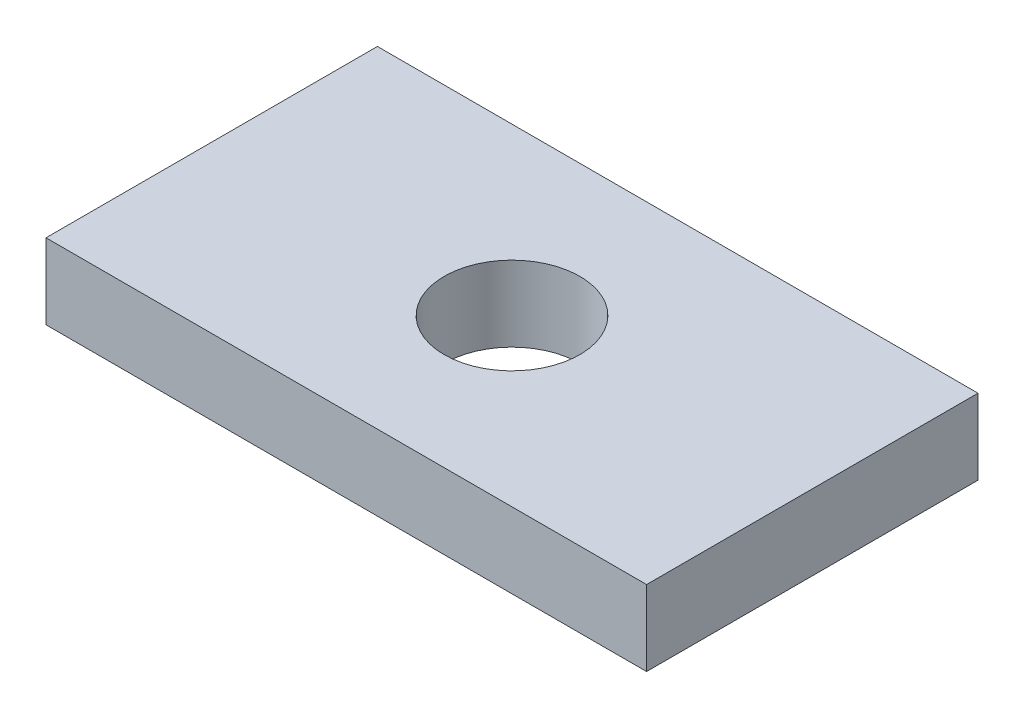
ISO-10303-21;
HEADER;
FILE_DESCRIPTION(('STEP AP214'),'2;1');
FILE_NAME('part.step','',(''),(''),'','','');
FILE_SCHEMA(('AUTOMOTIVE_DESIGN { 1 0 10303 214 1 1 1 1 }'));
ENDSEC;
DATA;
#1=APPLICATION_CONTEXT('core data for automotive mechanical design processes');
#2=APPLICATION_PROTOCOL_DEFINITION('international standard','automotive_design',2000,#1);
#3=PRODUCT_CONTEXT('',#1,'mechanical');
#4=PRODUCT('Part','Part','',(#3));
#5=PRODUCT_RELATED_PRODUCT_CATEGORY('part','',(#4));
#6=PRODUCT_DEFINITION_FORMATION('','',#4);
#7=PRODUCT_DEFINITION_CONTEXT('part definition',#1,'design');
#8=PRODUCT_DEFINITION('design','',#6,#7);
#9=PRODUCT_DEFINITION_SHAPE('','',#8);
#10=(LENGTH_UNIT() NAMED_UNIT(*) SI_UNIT(.MILLI.,.METRE.));
#11=(NAMED_UNIT(*) PLANE_ANGLE_UNIT() SI_UNIT($,.RADIAN.));
#12=(NAMED_UNIT(*) SI_UNIT($,.STERADIAN.) SOLID_ANGLE_UNIT());
#13=UNCERTAINTY_MEASURE_WITH_UNIT(LENGTH_MEASURE(1.E-05),#10,'distance_accuracy_value','');
#14=(GEOMETRIC_REPRESENTATION_CONTEXT(3) GLOBAL_UNCERTAINTY_ASSIGNED_CONTEXT((#13)) GLOBAL_UNIT_ASSIGNED_CONTEXT((#10,
#11,#12)) REPRESENTATION_CONTEXT('',''));
#15=CARTESIAN_POINT('',(0.,0.,0.));
#16=DIRECTION('',(0.,0.,1.));
#17=DIRECTION('',(1.,0.,0.));
#18=AXIS2_PLACEMENT_3D('',#15,#16,#17);
#19=CARTESIAN_POINT('',(0.,10.,0.));
#20=DIRECTION('',(1.,0.,0.));
#21=DIRECTION('',(0.,0.,-1.));
#22=AXIS2_PLACEMENT_3D('',#19,#20,#21);
#23=PLANE('',#22);
#24=DIRECTION('',(0.,0.,1.));
#25=VECTOR('',#24,1.);
#26=CARTESIAN_POINT('',(0.,0.,0.));
#27=LINE('',#26,#25);
#28=CARTESIAN_POINT('',(0.,0.,0.));
#29=VERTEX_POINT('',#28);
#30=CARTESIAN_POINT('',(0.,0.,43.9739388766753));
#31=VERTEX_POINT('',#30);
#32=EDGE_CURVE('E94',#29,#31,#27,.T.);
#33=ORIENTED_EDGE('',*,*,#32,.T.);
#34=DIRECTION('',(0.,-1.,0.));
#35=VECTOR('',#34,1.);
#36=CARTESIAN_POINT('',(0.,10.,43.9739388766753));
#37=LINE('',#36,#35);
#38=CARTESIAN_POINT('',(0.,10.,43.9739388766753));
#39=VERTEX_POINT('',#38);
#40=EDGE_CURVE('E11',#39,#31,#37,.T.);
#41=ORIENTED_EDGE('',*,*,#40,.F.);
#42=DIRECTION('',(0.,0.,1.));
#43=VECTOR('',#42,1.);
#44=CARTESIAN_POINT('',(0.,10.,0.));
#45=LINE('',#44,#43);
#46=CARTESIAN_POINT('',(0.,10.,0.));
#47=VERTEX_POINT('',#46);
#48=EDGE_CURVE('E82',#47,#39,#45,.T.);
#49=ORIENTED_EDGE('',*,*,#48,.F.);
#50=DIRECTION('',(0.,-1.,0.));
#51=VECTOR('',#50,1.);
#52=CARTESIAN_POINT('',(0.,10.,0.));
#53=LINE('',#52,#51);
#54=EDGE_CURVE('E90',#47,#29,#53,.T.);
#55=ORIENTED_EDGE('',*,*,#54,.T.);
#56=EDGE_LOOP('',(#33,#41,#49,#55));
#57=FACE_BOUND('',#56,.T.);
#58=ADVANCED_FACE('F31',(#57),#23,.F.);
#59=CARTESIAN_POINT('',(0.,10.,43.9739388766753));
#60=DIRECTION('',(0.,0.,-1.));
#61=DIRECTION('',(-1.,0.,0.));
#62=AXIS2_PLACEMENT_3D('',#59,#60,#61);
#63=PLANE('',#62);
#64=DIRECTION('',(1.,0.,0.));
#65=VECTOR('',#64,1.);
#66=CARTESIAN_POINT('',(0.,0.,43.9739388766753));
#67=LINE('',#66,#65);
#68=CARTESIAN_POINT('',(79.688684702695,0.,43.9739388766753));
#69=VERTEX_POINT('',#68);
#70=EDGE_CURVE('E86',#31,#69,#67,.T.);
#71=ORIENTED_EDGE('',*,*,#70,.T.);
#72=DIRECTION('',(0.,-1.,0.));
#73=VECTOR('',#72,1.);
#74=CARTESIAN_POINT('',(79.688684702695,10.,43.9739388766753));
#75=LINE('',#74,#73);
#76=CARTESIAN_POINT('',(79.688684702695,10.,43.9739388766753));
#77=VERTEX_POINT('',#76);
#78=EDGE_CURVE('E39',#77,#69,#75,.T.);
#79=ORIENTED_EDGE('',*,*,#78,.F.);
#80=DIRECTION('',(1.,0.,0.));
#81=VECTOR('',#80,1.);
#82=CARTESIAN_POINT('',(0.,10.,43.9739388766753));
#83=LINE('',#82,#81);
#84=EDGE_CURVE('E77',#39,#77,#83,.T.);
#85=ORIENTED_EDGE('',*,*,#84,.F.);
#86=ORIENTED_EDGE('',*,*,#40,.T.);
#87=EDGE_LOOP('',(#71,#79,#85,#86));
#88=FACE_BOUND('',#87,.T.);
#89=ADVANCED_FACE('F85',(#88),#63,.F.);
#90=CARTESIAN_POINT('',(79.688684702695,10.,0.));
#91=DIRECTION('',(-1.,0.,0.));
#92=DIRECTION('',(0.,0.,1.));
#93=AXIS2_PLACEMENT_3D('',#90,#91,#92);
#94=PLANE('',#93);
#95=DIRECTION('',(0.,0.,-1.));
#96=VECTOR('',#95,1.);
#97=CARTESIAN_POINT('',(79.688684702695,0.,0.));
#98=LINE('',#97,#96);
#99=CARTESIAN_POINT('',(79.688684702695,0.,0.));
#100=VERTEX_POINT('',#99);
#101=EDGE_CURVE('E64',#69,#100,#98,.T.);
#102=ORIENTED_EDGE('',*,*,#101,.T.);
#103=DIRECTION('',(0.,-1.,0.));
#104=VECTOR('',#103,1.);
#105=CARTESIAN_POINT('',(79.688684702695,10.,0.));
#106=LINE('',#105,#104);
#107=CARTESIAN_POINT('',(79.688684702695,10.,0.));
#108=VERTEX_POINT('',#107);
#109=EDGE_CURVE('E87',#108,#100,#106,.T.);
#110=ORIENTED_EDGE('',*,*,#109,.F.);
#111=DIRECTION('',(0.,0.,-1.));
#112=VECTOR('',#111,1.);
#113=CARTESIAN_POINT('',(79.688684702695,10.,0.));
#114=LINE('',#113,#112);
#115=EDGE_CURVE('E80',#77,#108,#114,.T.);
#116=ORIENTED_EDGE('',*,*,#115,.F.);
#117=ORIENTED_EDGE('',*,*,#78,.T.);
#118=EDGE_LOOP('',(#102,#110,#116,#117));
#119=FACE_BOUND('',#118,.T.);
#120=ADVANCED_FACE('F88',(#119),#94,.F.);
#121=CARTESIAN_POINT('',(0.,10.,0.));
#122=DIRECTION('',(0.,0.,1.));
#123=DIRECTION('',(1.,0.,0.));
#124=AXIS2_PLACEMENT_3D('',#121,#122,#123);
#125=PLANE('',#124);
#126=DIRECTION('',(-1.,0.,0.));
#127=VECTOR('',#126,1.);
#128=CARTESIAN_POINT('',(0.,0.,0.));
#129=LINE('',#128,#127);
#130=EDGE_CURVE('E70',#100,#29,#129,.T.);
#131=ORIENTED_EDGE('',*,*,#130,.T.);
#132=ORIENTED_EDGE('',*,*,#54,.F.);
#133=DIRECTION('',(-1.,0.,0.));
#134=VECTOR('',#133,1.);
#135=CARTESIAN_POINT('',(0.,10.,0.));
#136=LINE('',#135,#134);
#137=EDGE_CURVE('E47',#108,#47,#136,.T.);
#138=ORIENTED_EDGE('',*,*,#137,.F.);
#139=ORIENTED_EDGE('',*,*,#109,.T.);
#140=EDGE_LOOP('',(#131,#132,#138,#139));
#141=FACE_BOUND('',#140,.T.);
#142=ADVANCED_FACE('F102',(#141),#125,.F.);
#143=CARTESIAN_POINT('',(0.,10.,43.9739388766753));
#144=DIRECTION('',(0.,1.,0.));
#145=DIRECTION('',(0.,0.,1.));
#146=AXIS2_PLACEMENT_3D('',#143,#144,#145);
#147=PLANE('',#146);
#148=CARTESIAN_POINT('',(39.8443423513474,10.,21.9869694383378));
#149=DIRECTION('',(0.,1.,0.));
#150=DIRECTION('',(0.,0.,1.));
#151=AXIS2_PLACEMENT_3D('',#148,#149,#150);
#152=CIRCLE('',#151,9.);
#153=CARTESIAN_POINT('',(39.8443423513474,10.,30.9869694383378));
#154=VERTEX_POINT('',#153);
#155=EDGE_CURVE('E108',#154,#154,#152,.T.);
#156=ORIENTED_EDGE('',*,*,#155,.F.);
#157=EDGE_LOOP('',(#156));
#158=FACE_BOUND('',#157,.T.);
#159=ORIENTED_EDGE('',*,*,#48,.T.);
#160=ORIENTED_EDGE('',*,*,#84,.T.);
#161=ORIENTED_EDGE('',*,*,#115,.T.);
#162=ORIENTED_EDGE('',*,*,#137,.T.);
#163=EDGE_LOOP('',(#159,#160,#161,#162));
#164=FACE_BOUND('',#163,.T.);
#165=ADVANCED_FACE('F78',(#158,#164),#147,.T.);
#166=CARTESIAN_POINT('',(0.,0.,43.9739388766753));
#167=DIRECTION('',(0.,1.,0.));
#168=DIRECTION('',(0.,0.,1.));
#169=AXIS2_PLACEMENT_3D('',#166,#167,#168);
#170=PLANE('',#169);
#171=CARTESIAN_POINT('',(39.8443423513474,0.,21.9869694383378));
#172=DIRECTION('',(0.,1.,0.));
#173=DIRECTION('',(0.,0.,1.));
#174=AXIS2_PLACEMENT_3D('',#171,#172,#173);
#175=CIRCLE('',#174,9.);
#176=CARTESIAN_POINT('',(39.8443423513474,0.,30.9869694383378));
#177=VERTEX_POINT('',#176);
#178=EDGE_CURVE('E97',#177,#177,#175,.T.);
#179=ORIENTED_EDGE('',*,*,#178,.T.);
#180=EDGE_LOOP('',(#179));
#181=FACE_BOUND('',#180,.T.);
#182=ORIENTED_EDGE('',*,*,#32,.F.);
#183=ORIENTED_EDGE('',*,*,#130,.F.);
#184=ORIENTED_EDGE('',*,*,#101,.F.);
#185=ORIENTED_EDGE('',*,*,#70,.F.);
#186=EDGE_LOOP('',(#182,#183,#184,#185));
#187=FACE_BOUND('',#186,.T.);
#188=ADVANCED_FACE('F105',(#181,#187),#170,.F.);
#189=CARTESIAN_POINT('',(39.8443423513474,0.,21.9869694383378));
#190=DIRECTION('',(0.,1.,0.));
#191=DIRECTION('',(0.,0.,1.));
#192=AXIS2_PLACEMENT_3D('',#189,#190,#191);
#193=CYLINDRICAL_SURFACE('',#192,9.);
#194=ORIENTED_EDGE('',*,*,#178,.F.);
#195=EDGE_LOOP('',(#194));
#196=FACE_BOUND('',#195,.T.);
#197=ORIENTED_EDGE('',*,*,#155,.T.);
#198=EDGE_LOOP('',(#197));
#199=FACE_BOUND('',#198,.T.);
#200=ADVANCED_FACE('F115',(#196,#199),#193,.F.);
#201=CLOSED_SHELL('',(#58,#89,#120,#142,#165,#188,#200));
#202=MANIFOLD_SOLID_BREP('B2',#201);
#203=ADVANCED_BREP_SHAPE_REPRESENTATION('',(#18,#202),#14);
#204=SHAPE_DEFINITION_REPRESENTATION(#9,#203);
ENDSEC;
END-ISO-10303-21;
